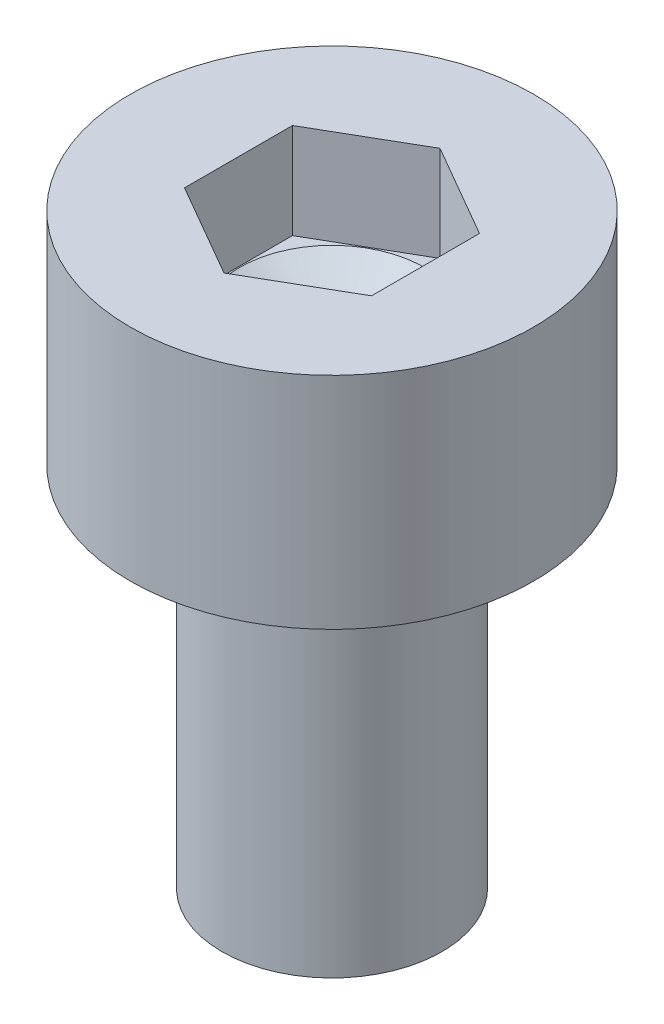
ISO-10303-21;
HEADER;
FILE_DESCRIPTION(('STEP AP214'),'2;1');
FILE_NAME('part.step','',(''),(''),'','','');
FILE_SCHEMA(('AUTOMOTIVE_DESIGN { 1 0 10303 214 1 1 1 1 }'));
ENDSEC;
DATA;
#1=APPLICATION_CONTEXT('core data for automotive mechanical design processes');
#2=APPLICATION_PROTOCOL_DEFINITION('international standard','automotive_design',2000,#1);
#3=PRODUCT_CONTEXT('',#1,'mechanical');
#4=PRODUCT('Part','Part','',(#3));
#5=PRODUCT_RELATED_PRODUCT_CATEGORY('part','',(#4));
#6=PRODUCT_DEFINITION_FORMATION('','',#4);
#7=PRODUCT_DEFINITION_CONTEXT('part definition',#1,'design');
#8=PRODUCT_DEFINITION('design','',#6,#7);
#9=PRODUCT_DEFINITION_SHAPE('','',#8);
#10=(LENGTH_UNIT() NAMED_UNIT(*) SI_UNIT(.MILLI.,.METRE.));
#11=(NAMED_UNIT(*) PLANE_ANGLE_UNIT() SI_UNIT($,.RADIAN.));
#12=(NAMED_UNIT(*) SI_UNIT($,.STERADIAN.) SOLID_ANGLE_UNIT());
#13=UNCERTAINTY_MEASURE_WITH_UNIT(LENGTH_MEASURE(1.E-05),#10,'distance_accuracy_value','');
#14=(GEOMETRIC_REPRESENTATION_CONTEXT(3) GLOBAL_UNCERTAINTY_ASSIGNED_CONTEXT((#13)) GLOBAL_UNIT_ASSIGNED_CONTEXT((#10,
#11,#12)) REPRESENTATION_CONTEXT('',''));
#15=CARTESIAN_POINT('',(0.,0.,0.));
#16=DIRECTION('',(0.,0.,1.));
#17=DIRECTION('',(1.,0.,0.));
#18=AXIS2_PLACEMENT_3D('',#15,#16,#17);
#19=CARTESIAN_POINT('',(0.,0.,0.));
#20=DIRECTION('',(0.,-1.,0.));
#21=DIRECTION('',(0.,0.,-1.));
#22=AXIS2_PLACEMENT_3D('',#19,#20,#21);
#23=PLANE('',#22);
#24=CARTESIAN_POINT('',(0.,0.,0.));
#25=DIRECTION('',(0.,-1.,0.));
#26=DIRECTION('',(0.,0.,-1.));
#27=AXIS2_PLACEMENT_3D('',#24,#25,#26);
#28=CIRCLE('',#27,2.75);
#29=CARTESIAN_POINT('',(0.,0.,-2.75));
#30=VERTEX_POINT('',#29);
#31=EDGE_CURVE('E11',#30,#30,#28,.T.);
#32=ORIENTED_EDGE('',*,*,#31,.T.);
#33=EDGE_LOOP('',(#32));
#34=FACE_BOUND('',#33,.T.);
#35=CARTESIAN_POINT('',(0.,0.,0.));
#36=DIRECTION('',(0.,-1.,0.));
#37=DIRECTION('',(0.,0.,-1.));
#38=AXIS2_PLACEMENT_3D('',#35,#36,#37);
#39=CIRCLE('',#38,1.5);
#40=CARTESIAN_POINT('',(0.,0.,-1.5));
#41=VERTEX_POINT('',#40);
#42=EDGE_CURVE('E143',#41,#41,#39,.T.);
#43=ORIENTED_EDGE('',*,*,#42,.F.);
#44=EDGE_LOOP('',(#43));
#45=FACE_BOUND('',#44,.T.);
#46=ADVANCED_FACE('F17',(#34,#45),#23,.T.);
#47=CARTESIAN_POINT('',(0.,0.,0.));
#48=DIRECTION('',(0.,-1.,0.));
#49=DIRECTION('',(0.,0.,-1.));
#50=AXIS2_PLACEMENT_3D('',#47,#48,#49);
#51=CYLINDRICAL_SURFACE('',#50,2.75);
#52=CARTESIAN_POINT('',(0.,3.,0.));
#53=DIRECTION('',(0.,-1.,0.));
#54=DIRECTION('',(0.,0.,-1.));
#55=AXIS2_PLACEMENT_3D('',#52,#53,#54);
#56=CIRCLE('',#55,2.75);
#57=CARTESIAN_POINT('',(0.,3.,-2.75));
#58=VERTEX_POINT('',#57);
#59=EDGE_CURVE('E24',#58,#58,#56,.T.);
#60=ORIENTED_EDGE('',*,*,#59,.T.);
#61=EDGE_LOOP('',(#60));
#62=FACE_BOUND('',#61,.T.);
#63=ORIENTED_EDGE('',*,*,#31,.F.);
#64=EDGE_LOOP('',(#63));
#65=FACE_BOUND('',#64,.T.);
#66=ADVANCED_FACE('F120',(#62,#65),#51,.T.);
#67=CARTESIAN_POINT('',(2.75,3.,0.));
#68=DIRECTION('',(0.,1.,0.));
#69=DIRECTION('',(0.,0.,1.));
#70=AXIS2_PLACEMENT_3D('',#67,#68,#69);
#71=PLANE('',#70);
#72=DIRECTION('',(-0.866025403784439,0.,-0.5));
#73=VECTOR('',#72,1.);
#74=CARTESIAN_POINT('',(1.275,3.,-0.736121593216773));
#75=LINE('',#74,#73);
#76=CARTESIAN_POINT('',(1.275,3.,-0.736121593216773));
#77=VERTEX_POINT('',#76);
#78=CARTESIAN_POINT('',(0.,3.,-1.47224318643355));
#79=VERTEX_POINT('',#78);
#80=EDGE_CURVE('E31',#77,#79,#75,.T.);
#81=ORIENTED_EDGE('',*,*,#80,.F.);
#82=DIRECTION('',(0.,0.,-1.));
#83=VECTOR('',#82,1.);
#84=CARTESIAN_POINT('',(1.275,3.,0.736121593216772));
#85=LINE('',#84,#83);
#86=CARTESIAN_POINT('',(1.275,3.,0.736121593216772));
#87=VERTEX_POINT('',#86);
#88=EDGE_CURVE('E101',#87,#77,#85,.T.);
#89=ORIENTED_EDGE('',*,*,#88,.F.);
#90=DIRECTION('',(0.866025403784439,0.,-0.5));
#91=VECTOR('',#90,1.);
#92=CARTESIAN_POINT('',(0.,3.,1.47224318643355));
#93=LINE('',#92,#91);
#94=CARTESIAN_POINT('',(0.,3.,1.47224318643355));
#95=VERTEX_POINT('',#94);
#96=EDGE_CURVE('E95',#95,#87,#93,.T.);
#97=ORIENTED_EDGE('',*,*,#96,.F.);
#98=DIRECTION('',(0.866025403784439,0.,0.5));
#99=VECTOR('',#98,1.);
#100=CARTESIAN_POINT('',(-1.275,3.,0.736121593216773));
#101=LINE('',#100,#99);
#102=CARTESIAN_POINT('',(-1.275,3.,0.736121593216773));
#103=VERTEX_POINT('',#102);
#104=EDGE_CURVE('E93',#103,#95,#101,.T.);
#105=ORIENTED_EDGE('',*,*,#104,.F.);
#106=DIRECTION('',(0.,0.,1.));
#107=VECTOR('',#106,1.);
#108=CARTESIAN_POINT('',(-1.275,3.,-0.736121593216773));
#109=LINE('',#108,#107);
#110=CARTESIAN_POINT('',(-1.275,3.,-0.736121593216773));
#111=VERTEX_POINT('',#110);
#112=EDGE_CURVE('E75',#111,#103,#109,.T.);
#113=ORIENTED_EDGE('',*,*,#112,.F.);
#114=DIRECTION('',(-0.866025403784439,0.,0.5));
#115=VECTOR('',#114,1.);
#116=CARTESIAN_POINT('',(0.,3.,-1.47224318643354));
#117=LINE('',#116,#115);
#118=EDGE_CURVE('E85',#79,#111,#117,.T.);
#119=ORIENTED_EDGE('',*,*,#118,.F.);
#120=EDGE_LOOP('',(#81,#89,#97,#105,#113,#119));
#121=FACE_BOUND('',#120,.T.);
#122=ORIENTED_EDGE('',*,*,#59,.F.);
#123=EDGE_LOOP('',(#122));
#124=FACE_BOUND('',#123,.T.);
#125=ADVANCED_FACE('F89',(#121,#124),#71,.T.);
#126=CARTESIAN_POINT('',(1.275,-2.19518934071246,-0.736121593216773));
#127=DIRECTION('',(0.5,0.,-0.866025403784439));
#128=DIRECTION('',(-0.866025403784439,0.,-0.5));
#129=AXIS2_PLACEMENT_3D('',#126,#127,#128);
#130=PLANE('',#129);
#131=DIRECTION('',(0.866025403784439,0.,0.5));
#132=VECTOR('',#131,1.);
#133=CARTESIAN_POINT('',(1.275,1.7,-0.736121593216773));
#134=LINE('',#133,#132);
#135=CARTESIAN_POINT('',(0.,1.7,-1.47224318643354));
#136=VERTEX_POINT('',#135);
#137=CARTESIAN_POINT('',(1.275,1.7,-0.736121593216773));
#138=VERTEX_POINT('',#137);
#139=EDGE_CURVE('E115',#136,#138,#134,.T.);
#140=ORIENTED_EDGE('',*,*,#139,.T.);
#141=DIRECTION('',(0.,1.,0.));
#142=VECTOR('',#141,1.);
#143=CARTESIAN_POINT('',(1.275,-2.19518934071246,-0.736121593216773));
#144=LINE('',#143,#142);
#145=EDGE_CURVE('E104',#138,#77,#144,.T.);
#146=ORIENTED_EDGE('',*,*,#145,.T.);
#147=ORIENTED_EDGE('',*,*,#80,.T.);
#148=DIRECTION('',(0.,1.,0.));
#149=VECTOR('',#148,1.);
#150=CARTESIAN_POINT('',(0.,-2.19518934071246,-1.47224318643354));
#151=LINE('',#150,#149);
#152=EDGE_CURVE('E82',#136,#79,#151,.T.);
#153=ORIENTED_EDGE('',*,*,#152,.F.);
#154=EDGE_LOOP('',(#140,#146,#147,#153));
#155=FACE_BOUND('',#154,.T.);
#156=ADVANCED_FACE('F123',(#155),#130,.F.);
#157=CARTESIAN_POINT('',(1.275,-2.19518934071246,0.736121593216772));
#158=DIRECTION('',(1.,0.,0.));
#159=DIRECTION('',(0.,0.,-1.));
#160=AXIS2_PLACEMENT_3D('',#157,#158,#159);
#161=PLANE('',#160);
#162=DIRECTION('',(0.,0.,1.));
#163=VECTOR('',#162,1.);
#164=CARTESIAN_POINT('',(1.275,1.7,0.736121593216772));
#165=LINE('',#164,#163);
#166=CARTESIAN_POINT('',(1.275,1.7,0.736121593216772));
#167=VERTEX_POINT('',#166);
#168=EDGE_CURVE('E155',#138,#167,#165,.T.);
#169=ORIENTED_EDGE('',*,*,#168,.T.);
#170=DIRECTION('',(0.,1.,0.));
#171=VECTOR('',#170,1.);
#172=CARTESIAN_POINT('',(1.275,-2.19518934071246,0.736121593216772));
#173=LINE('',#172,#171);
#174=EDGE_CURVE('E106',#167,#87,#173,.T.);
#175=ORIENTED_EDGE('',*,*,#174,.T.);
#176=ORIENTED_EDGE('',*,*,#88,.T.);
#177=ORIENTED_EDGE('',*,*,#145,.F.);
#178=EDGE_LOOP('',(#169,#175,#176,#177));
#179=FACE_BOUND('',#178,.T.);
#180=ADVANCED_FACE('F131',(#179),#161,.F.);
#181=CARTESIAN_POINT('',(0.,-2.19518934071246,1.47224318643355));
#182=DIRECTION('',(0.5,0.,0.866025403784438));
#183=DIRECTION('',(0.866025403784439,0.,-0.5));
#184=AXIS2_PLACEMENT_3D('',#181,#182,#183);
#185=PLANE('',#184);
#186=DIRECTION('',(-0.866025403784439,0.,0.5));
#187=VECTOR('',#186,1.);
#188=CARTESIAN_POINT('',(0.,1.7,1.47224318643355));
#189=LINE('',#188,#187);
#190=CARTESIAN_POINT('',(0.,1.7,1.47224318643355));
#191=VERTEX_POINT('',#190);
#192=EDGE_CURVE('E153',#167,#191,#189,.T.);
#193=ORIENTED_EDGE('',*,*,#192,.T.);
#194=DIRECTION('',(0.,1.,0.));
#195=VECTOR('',#194,1.);
#196=CARTESIAN_POINT('',(0.,-2.19518934071246,1.47224318643355));
#197=LINE('',#196,#195);
#198=EDGE_CURVE('E108',#191,#95,#197,.T.);
#199=ORIENTED_EDGE('',*,*,#198,.T.);
#200=ORIENTED_EDGE('',*,*,#96,.T.);
#201=ORIENTED_EDGE('',*,*,#174,.F.);
#202=EDGE_LOOP('',(#193,#199,#200,#201));
#203=FACE_BOUND('',#202,.T.);
#204=ADVANCED_FACE('F168',(#203),#185,.F.);
#205=CARTESIAN_POINT('',(-1.275,-2.19518934071246,0.736121593216773));
#206=DIRECTION('',(-0.5,0.,0.866025403784439));
#207=DIRECTION('',(0.866025403784439,0.,0.5));
#208=AXIS2_PLACEMENT_3D('',#205,#206,#207);
#209=PLANE('',#208);
#210=DIRECTION('',(-0.866025403784439,0.,-0.5));
#211=VECTOR('',#210,1.);
#212=CARTESIAN_POINT('',(-1.275,1.7,0.736121593216773));
#213=LINE('',#212,#211);
#214=CARTESIAN_POINT('',(-1.275,1.7,0.736121593216773));
#215=VERTEX_POINT('',#214);
#216=EDGE_CURVE('E151',#191,#215,#213,.T.);
#217=ORIENTED_EDGE('',*,*,#216,.T.);
#218=DIRECTION('',(0.,1.,0.));
#219=VECTOR('',#218,1.);
#220=CARTESIAN_POINT('',(-1.275,-2.19518934071246,0.736121593216773));
#221=LINE('',#220,#219);
#222=EDGE_CURVE('E81',#215,#103,#221,.T.);
#223=ORIENTED_EDGE('',*,*,#222,.T.);
#224=ORIENTED_EDGE('',*,*,#104,.T.);
#225=ORIENTED_EDGE('',*,*,#198,.F.);
#226=EDGE_LOOP('',(#217,#223,#224,#225));
#227=FACE_BOUND('',#226,.T.);
#228=ADVANCED_FACE('F171',(#227),#209,.F.);
#229=CARTESIAN_POINT('',(-1.275,-2.19518934071246,-0.736121593216773));
#230=DIRECTION('',(-1.,0.,0.));
#231=DIRECTION('',(0.,0.,1.));
#232=AXIS2_PLACEMENT_3D('',#229,#230,#231);
#233=PLANE('',#232);
#234=DIRECTION('',(0.,0.,-1.));
#235=VECTOR('',#234,1.);
#236=CARTESIAN_POINT('',(-1.275,1.7,-0.736121593216773));
#237=LINE('',#236,#235);
#238=CARTESIAN_POINT('',(-1.275,1.7,-0.736121593216773));
#239=VERTEX_POINT('',#238);
#240=EDGE_CURVE('E78',#215,#239,#237,.T.);
#241=ORIENTED_EDGE('',*,*,#240,.T.);
#242=DIRECTION('',(0.,1.,0.));
#243=VECTOR('',#242,1.);
#244=CARTESIAN_POINT('',(-1.275,-2.19518934071246,-0.736121593216773));
#245=LINE('',#244,#243);
#246=EDGE_CURVE('E70',#239,#111,#245,.T.);
#247=ORIENTED_EDGE('',*,*,#246,.T.);
#248=ORIENTED_EDGE('',*,*,#112,.T.);
#249=ORIENTED_EDGE('',*,*,#222,.F.);
#250=EDGE_LOOP('',(#241,#247,#248,#249));
#251=FACE_BOUND('',#250,.T.);
#252=ADVANCED_FACE('F72',(#251),#233,.F.);
#253=CARTESIAN_POINT('',(0.,-2.19518934071246,-1.47224318643354));
#254=DIRECTION('',(-0.5,0.,-0.866025403784439));
#255=DIRECTION('',(-0.866025403784439,0.,0.5));
#256=AXIS2_PLACEMENT_3D('',#253,#254,#255);
#257=PLANE('',#256);
#258=DIRECTION('',(0.866025403784439,0.,-0.5));
#259=VECTOR('',#258,1.);
#260=CARTESIAN_POINT('',(0.,1.7,-1.47224318643354));
#261=LINE('',#260,#259);
#262=EDGE_CURVE('E112',#239,#136,#261,.T.);
#263=ORIENTED_EDGE('',*,*,#262,.T.);
#264=ORIENTED_EDGE('',*,*,#152,.T.);
#265=ORIENTED_EDGE('',*,*,#118,.T.);
#266=ORIENTED_EDGE('',*,*,#246,.F.);
#267=EDGE_LOOP('',(#263,#264,#265,#266));
#268=FACE_BOUND('',#267,.T.);
#269=ADVANCED_FACE('F86',(#268),#257,.F.);
#270=CARTESIAN_POINT('',(0.,1.7,0.));
#271=DIRECTION('',(0.,1.,0.));
#272=DIRECTION('',(0.,0.,1.));
#273=AXIS2_PLACEMENT_3D('',#270,#271,#272);
#274=PLANE('',#273);
#275=CARTESIAN_POINT('',(0.,1.7,0.));
#276=DIRECTION('',(0.,1.,0.));
#277=DIRECTION('',(0.,0.,1.));
#278=AXIS2_PLACEMENT_3D('',#275,#276,#277);
#279=CIRCLE('',#278,1.26);
#280=CARTESIAN_POINT('',(0.,1.7,1.26));
#281=VERTEX_POINT('',#280);
#282=EDGE_CURVE('E114',#281,#281,#279,.T.);
#283=ORIENTED_EDGE('',*,*,#282,.F.);
#284=EDGE_LOOP('',(#283));
#285=FACE_BOUND('',#284,.T.);
#286=ORIENTED_EDGE('',*,*,#139,.F.);
#287=ORIENTED_EDGE('',*,*,#262,.F.);
#288=ORIENTED_EDGE('',*,*,#240,.F.);
#289=ORIENTED_EDGE('',*,*,#216,.F.);
#290=ORIENTED_EDGE('',*,*,#192,.F.);
#291=ORIENTED_EDGE('',*,*,#168,.F.);
#292=EDGE_LOOP('',(#286,#287,#288,#289,#290,#291));
#293=FACE_BOUND('',#292,.T.);
#294=ADVANCED_FACE('F162',(#285,#293),#274,.T.);
#295=CARTESIAN_POINT('',(0.,1.7,0.));
#296=DIRECTION('',(0.,1.,0.));
#297=DIRECTION('',(0.,0.,1.));
#298=AXIS2_PLACEMENT_3D('',#295,#296,#297);
#299=CONICAL_SURFACE('',#298,1.26,1.0471975511966);
#300=CARTESIAN_POINT('',(0.,0.972538660821063,0.));
#301=VERTEX_POINT('',#300);
#302=VERTEX_LOOP('',#301);
#303=FACE_BOUND('',#302,.T.);
#304=ORIENTED_EDGE('',*,*,#282,.T.);
#305=EDGE_LOOP('',(#304));
#306=FACE_BOUND('',#305,.T.);
#307=ADVANCED_FACE('F184',(#303,#306),#299,.F.);
#308=CARTESIAN_POINT('',(0.,-5.,0.));
#309=DIRECTION('',(0.,1.,0.));
#310=DIRECTION('',(0.,0.,1.));
#311=AXIS2_PLACEMENT_3D('',#308,#309,#310);
#312=CYLINDRICAL_SURFACE('',#311,1.5);
#313=CARTESIAN_POINT('',(0.,-5.,0.));
#314=DIRECTION('',(0.,-1.,0.));
#315=DIRECTION('',(0.,0.,-1.));
#316=AXIS2_PLACEMENT_3D('',#313,#314,#315);
#317=CIRCLE('',#316,1.5);
#318=CARTESIAN_POINT('',(0.,-5.,-1.5));
#319=VERTEX_POINT('',#318);
#320=EDGE_CURVE('E145',#319,#319,#317,.T.);
#321=ORIENTED_EDGE('',*,*,#320,.F.);
#322=EDGE_LOOP('',(#321));
#323=FACE_BOUND('',#322,.T.);
#324=ORIENTED_EDGE('',*,*,#42,.T.);
#325=EDGE_LOOP('',(#324));
#326=FACE_BOUND('',#325,.T.);
#327=ADVANCED_FACE('F186',(#323,#326),#312,.T.);
#328=CARTESIAN_POINT('',(0.,-5.,0.));
#329=DIRECTION('',(0.,-1.,0.));
#330=DIRECTION('',(0.,0.,-1.));
#331=AXIS2_PLACEMENT_3D('',#328,#329,#330);
#332=PLANE('',#331);
#333=ORIENTED_EDGE('',*,*,#320,.T.);
#334=EDGE_LOOP('',(#333));
#335=FACE_BOUND('',#334,.T.);
#336=ADVANCED_FACE('F192',(#335),#332,.T.);
#337=CLOSED_SHELL('',(#46,#66,#125,#156,#180,#204,#228,#252,#269,#294,#307,#327,#336));
#338=MANIFOLD_SOLID_BREP('B1',#337);
#339=ADVANCED_BREP_SHAPE_REPRESENTATION('',(#18,#338),#14);
#340=SHAPE_DEFINITION_REPRESENTATION(#9,#339);
ENDSEC;
END-ISO-10303-21;
